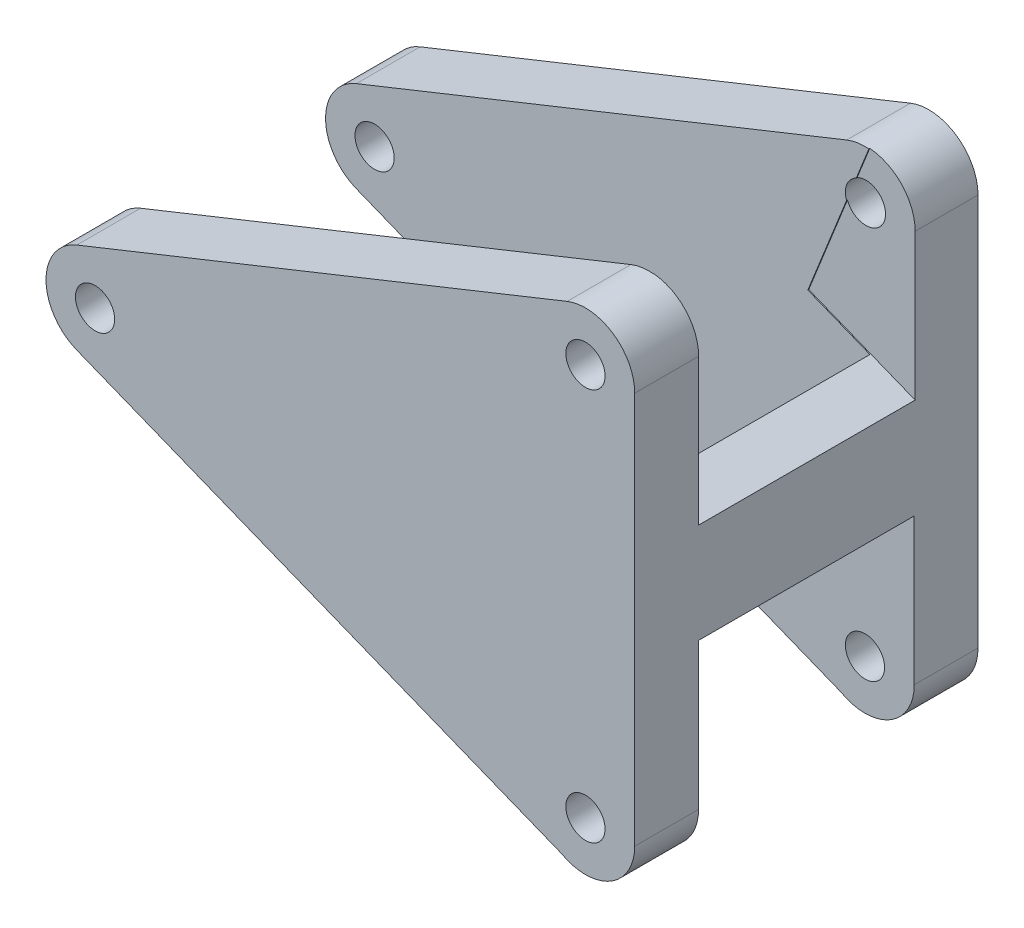
ISO-10303-21;
HEADER;
FILE_DESCRIPTION(('STEP AP214'),'2;1');
FILE_NAME('part.step','',(''),(''),'','','');
FILE_SCHEMA(('AUTOMOTIVE_DESIGN { 1 0 10303 214 1 1 1 1 }'));
ENDSEC;
DATA;
#1=APPLICATION_CONTEXT('core data for automotive mechanical design processes');
#2=APPLICATION_PROTOCOL_DEFINITION('international standard','automotive_design',2000,#1);
#3=PRODUCT_CONTEXT('',#1,'mechanical');
#4=PRODUCT('Part','Part','',(#3));
#5=PRODUCT_RELATED_PRODUCT_CATEGORY('part','',(#4));
#6=PRODUCT_DEFINITION_FORMATION('','',#4);
#7=PRODUCT_DEFINITION_CONTEXT('part definition',#1,'design');
#8=PRODUCT_DEFINITION('design','',#6,#7);
#9=PRODUCT_DEFINITION_SHAPE('','',#8);
#10=(LENGTH_UNIT() NAMED_UNIT(*) SI_UNIT(.MILLI.,.METRE.));
#11=(NAMED_UNIT(*) PLANE_ANGLE_UNIT() SI_UNIT($,.RADIAN.));
#12=(NAMED_UNIT(*) SI_UNIT($,.STERADIAN.) SOLID_ANGLE_UNIT());
#13=UNCERTAINTY_MEASURE_WITH_UNIT(LENGTH_MEASURE(1.E-05),#10,'distance_accuracy_value','');
#14=(GEOMETRIC_REPRESENTATION_CONTEXT(3) GLOBAL_UNCERTAINTY_ASSIGNED_CONTEXT((#13)) GLOBAL_UNIT_ASSIGNED_CONTEXT((#10,
#11,#12)) REPRESENTATION_CONTEXT('',''));
#15=CARTESIAN_POINT('',(0.,0.,0.));
#16=DIRECTION('',(0.,0.,1.));
#17=DIRECTION('',(1.,0.,0.));
#18=AXIS2_PLACEMENT_3D('',#15,#16,#17);
#19=CARTESIAN_POINT('',(30.5000000000063,24.9971540316062,28.4839748057166));
#20=DIRECTION('',(-1.,0.,0.));
#21=DIRECTION('',(0.,-1.,0.));
#22=AXIS2_PLACEMENT_3D('',#19,#20,#21);
#23=PLANE('',#22);
#24=DIRECTION('',(0.,0.,1.));
#25=VECTOR('',#24,1.);
#26=CARTESIAN_POINT('',(30.5000000000064,-21.9364916731021,35.));
#27=LINE('',#26,#25);
#28=CARTESIAN_POINT('',(30.5000000000064,-21.9364916731021,28.4875838937886));
#29=VERTEX_POINT('',#28);
#30=CARTESIAN_POINT('',(30.5000000000064,-21.9364916731021,28.5));
#31=VERTEX_POINT('',#30);
#32=EDGE_CURVE('E48',#29,#31,#27,.T.);
#33=ORIENTED_EDGE('',*,*,#32,.F.);
#34=DIRECTION('',(0.,1.,0.));
#35=VECTOR('',#34,1.);
#36=CARTESIAN_POINT('',(30.4999999999983,-24.9971540316023,28.4875838937886));
#37=LINE('',#36,#35);
#38=CARTESIAN_POINT('',(30.4999999999983,-24.9971540316023,28.4875838937886));
#39=VERTEX_POINT('',#38);
#40=EDGE_CURVE('E450',#39,#29,#37,.T.);
#41=ORIENTED_EDGE('',*,*,#40,.F.);
#42=DIRECTION('',(0.,0.,1.));
#43=VECTOR('',#42,1.);
#44=CARTESIAN_POINT('',(30.5000000000064,-24.9971540316024,28.4839748057166));
#45=LINE('',#44,#43);
#46=CARTESIAN_POINT('',(30.5000000000064,-24.9971540316011,28.5));
#47=VERTEX_POINT('',#46);
#48=EDGE_CURVE('E41',#39,#47,#45,.T.);
#49=ORIENTED_EDGE('',*,*,#48,.T.);
#50=DIRECTION('',(0.,-1.,0.));
#51=VECTOR('',#50,1.);
#52=CARTESIAN_POINT('',(30.5000000000063,24.9971540316062,28.5));
#53=LINE('',#52,#51);
#54=EDGE_CURVE('E229',#31,#47,#53,.T.);
#55=ORIENTED_EDGE('',*,*,#54,.F.);
#56=EDGE_LOOP('',(#33,#41,#49,#55));
#57=FACE_BOUND('',#56,.T.);
#58=ADVANCED_FACE('F33',(#57),#23,.T.);
#59=CARTESIAN_POINT('',(24.1724969948369,9.42974260186761,6.40756694681244));
#60=DIRECTION('',(-0.928632371137816,0.371001238912968,0.));
#61=DIRECTION('',(-0.371001238912968,-0.928632371137816,0.));
#62=AXIS2_PLACEMENT_3D('',#59,#60,#61);
#63=PLANE('',#62);
#64=DIRECTION('',(-0.371001238912968,-0.928632371137816,0.));
#65=VECTOR('',#64,1.);
#66=CARTESIAN_POINT('',(24.1724969948369,9.42974260186761,6.40756694681244));
#67=LINE('',#66,#65);
#68=CARTESIAN_POINT('',(28.1213591908641,19.3139178545909,6.40756694681244));
#69=VERTEX_POINT('',#68);
#70=CARTESIAN_POINT('',(24.1724969948369,9.42974260186761,6.40756694681244));
#71=VERTEX_POINT('',#70);
#72=EDGE_CURVE('E327',#69,#71,#67,.T.);
#73=ORIENTED_EDGE('',*,*,#72,.F.);
#74=DIRECTION('',(0.,0.,1.));
#75=VECTOR('',#74,1.);
#76=CARTESIAN_POINT('',(28.1213591908641,19.3139178545909,35.));
#77=LINE('',#76,#75);
#78=CARTESIAN_POINT('',(28.1213591908641,19.3139178545909,6.5));
#79=VERTEX_POINT('',#78);
#80=EDGE_CURVE('E469',#69,#79,#77,.T.);
#81=ORIENTED_EDGE('',*,*,#80,.T.);
#82=DIRECTION('',(0.371001238912964,0.928632371137818,0.));
#83=VECTOR('',#82,1.);
#84=CARTESIAN_POINT('',(24.1724969948449,9.42974260185976,6.5));
#85=LINE('',#84,#83);
#86=CARTESIAN_POINT('',(24.1724969948449,9.42974260185976,6.5));
#87=VERTEX_POINT('',#86);
#88=EDGE_CURVE('E387',#87,#79,#85,.T.);
#89=ORIENTED_EDGE('',*,*,#88,.F.);
#90=DIRECTION('',(0.,0.,1.));
#91=VECTOR('',#90,1.);
#92=CARTESIAN_POINT('',(24.1724969948369,9.42974260186761,6.40756694681244));
#93=LINE('',#92,#91);
#94=EDGE_CURVE('E334',#71,#87,#93,.T.);
#95=ORIENTED_EDGE('',*,*,#94,.F.);
#96=EDGE_LOOP('',(#73,#81,#89,#95));
#97=FACE_BOUND('',#96,.T.);
#98=ADVANCED_FACE('F468',(#97),#63,.F.);
#99=DIRECTION('',(0.,0.,1.));
#100=VECTOR('',#99,1.);
#101=CARTESIAN_POINT('',(30.5000000000064,-18.0635083268979,35.));
#102=LINE('',#101,#100);
#103=CARTESIAN_POINT('',(30.5000000000064,-18.0635083268979,28.5));
#104=VERTEX_POINT('',#103);
#105=CARTESIAN_POINT('',(30.5000000000064,-18.0635083268979,28.4875838937886));
#106=VERTEX_POINT('',#105);
#107=EDGE_CURVE('E207',#104,#106,#102,.F.);
#108=ORIENTED_EDGE('',*,*,#107,.F.);
#109=CARTESIAN_POINT('',(30.5000000000063,18.0635083268979,28.5));
#110=VERTEX_POINT('',#109);
#111=EDGE_CURVE('E219',#110,#104,#53,.T.);
#112=ORIENTED_EDGE('',*,*,#111,.F.);
#113=DIRECTION('',(0.,0.,1.));
#114=VECTOR('',#113,1.);
#115=CARTESIAN_POINT('',(30.5000000000063,18.0635083268979,35.));
#116=LINE('',#115,#114);
#117=CARTESIAN_POINT('',(30.5000000000063,18.0635083268979,28.4839748057166));
#118=VERTEX_POINT('',#117);
#119=EDGE_CURVE('E482',#118,#110,#116,.T.);
#120=ORIENTED_EDGE('',*,*,#119,.F.);
#121=DIRECTION('',(0.,1.,0.));
#122=VECTOR('',#121,1.);
#123=CARTESIAN_POINT('',(30.5000000000063,6.90181925232222,28.4839748057166));
#124=LINE('',#123,#122);
#125=CARTESIAN_POINT('',(30.4999999999937,6.90181925232222,28.4839748057166));
#126=VERTEX_POINT('',#125);
#127=EDGE_CURVE('E407',#126,#118,#124,.T.);
#128=ORIENTED_EDGE('',*,*,#127,.F.);
#129=DIRECTION('',(0.,0.,1.));
#130=VECTOR('',#129,1.);
#131=CARTESIAN_POINT('',(30.4999999999937,6.90181925232222,6.5));
#132=LINE('',#131,#130);
#133=CARTESIAN_POINT('',(30.4999999999937,6.90181925232683,6.5));
#134=VERTEX_POINT('',#133);
#135=EDGE_CURVE('E397',#134,#126,#132,.T.);
#136=ORIENTED_EDGE('',*,*,#135,.F.);
#137=DIRECTION('',(0.,1.,0.));
#138=VECTOR('',#137,1.);
#139=CARTESIAN_POINT('',(30.4999999999937,-24.9971540316023,6.5));
#140=LINE('',#139,#138);
#141=CARTESIAN_POINT('',(30.4999999999937,-6.89705549864466,6.5));
#142=VERTEX_POINT('',#141);
#143=EDGE_CURVE('E382',#142,#134,#140,.T.);
#144=ORIENTED_EDGE('',*,*,#143,.F.);
#145=DIRECTION('',(0.,0.,-1.));
#146=VECTOR('',#145,1.);
#147=CARTESIAN_POINT('',(30.4999999999983,-6.89705549864466,28.4875838937886));
#148=LINE('',#147,#146);
#149=CARTESIAN_POINT('',(30.4999999999983,-6.89705549864466,28.4875838937886));
#150=VERTEX_POINT('',#149);
#151=EDGE_CURVE('E377',#150,#142,#148,.T.);
#152=ORIENTED_EDGE('',*,*,#151,.F.);
#153=EDGE_CURVE('E221',#106,#150,#37,.T.);
#154=ORIENTED_EDGE('',*,*,#153,.F.);
#155=EDGE_LOOP('',(#108,#112,#120,#128,#136,#144,#152,#154));
#156=FACE_BOUND('',#155,.T.);
#157=ADVANCED_FACE('F217',(#156),#23,.T.);
#158=CARTESIAN_POINT('',(30.,-20.,35.));
#159=DIRECTION('',(0.,0.,-1.));
#160=DIRECTION('',(-1.,0.,0.));
#161=AXIS2_PLACEMENT_3D('',#158,#159,#160);
#162=PLANE('',#161);
#163=CARTESIAN_POINT('',(30.,-20.,35.));
#164=DIRECTION('',(0.,0.,1.));
#165=DIRECTION('',(1.,0.,0.));
#166=AXIS2_PLACEMENT_3D('',#163,#164,#165);
#167=CIRCLE('',#166,1.99999999999999);
#168=CARTESIAN_POINT('',(32.,-20.,35.));
#169=VERTEX_POINT('',#168);
#170=EDGE_CURVE('E212',#169,#169,#167,.T.);
#171=ORIENTED_EDGE('',*,*,#170,.F.);
#172=EDGE_LOOP('',(#171));
#173=FACE_BOUND('',#172,.T.);
#174=CARTESIAN_POINT('',(-20.,0.,35.));
#175=DIRECTION('',(0.,0.,1.));
#176=DIRECTION('',(1.,0.,0.));
#177=AXIS2_PLACEMENT_3D('',#174,#175,#176);
#178=CIRCLE('',#177,1.99999999999998);
#179=CARTESIAN_POINT('',(-18.,0.,35.));
#180=VERTEX_POINT('',#179);
#181=EDGE_CURVE('E500',#180,#180,#178,.T.);
#182=ORIENTED_EDGE('',*,*,#181,.F.);
#183=EDGE_LOOP('',(#182));
#184=FACE_BOUND('',#183,.T.);
#185=CARTESIAN_POINT('',(30.,-20.,35.));
#186=DIRECTION('',(0.,0.,1.));
#187=DIRECTION('',(-1.,0.,0.));
#188=AXIS2_PLACEMENT_3D('',#185,#186,#187);
#189=CIRCLE('',#188,5.02210597414605);
#190=CARTESIAN_POINT('',(27.5325788494892,-24.3741720681251,35.));
#191=VERTEX_POINT('',#190);
#192=CARTESIAN_POINT('',(35.0221059741461,-20.,35.));
#193=VERTEX_POINT('',#192);
#194=EDGE_CURVE('E257',#191,#193,#189,.T.);
#195=ORIENTED_EDGE('',*,*,#194,.T.);
#196=DIRECTION('',(0.,1.,0.));
#197=VECTOR('',#196,1.);
#198=CARTESIAN_POINT('',(35.0221059741461,19.9999999999929,35.));
#199=LINE('',#198,#197);
#200=CARTESIAN_POINT('',(35.0221059741461,19.9999999999929,35.));
#201=VERTEX_POINT('',#200);
#202=EDGE_CURVE('E262',#193,#201,#199,.T.);
#203=ORIENTED_EDGE('',*,*,#202,.T.);
#204=CARTESIAN_POINT('',(29.9999999999952,19.9999999999929,35.));
#205=DIRECTION('',(0.,0.,1.));
#206=DIRECTION('',(-1.,0.,0.));
#207=AXIS2_PLACEMENT_3D('',#204,#205,#206);
#208=CIRCLE('',#207,5.02210597415085);
#209=CARTESIAN_POINT('',(28.1329227098393,24.6621422981415,35.));
#210=VERTEX_POINT('',#209);
#211=EDGE_CURVE('E268',#201,#210,#208,.T.);
#212=ORIENTED_EDGE('',*,*,#211,.T.);
#213=DIRECTION('',(-0.928324157663127,-0.371771782548172,0.));
#214=VECTOR('',#213,1.);
#215=CARTESIAN_POINT('',(-21.8588589127408,4.64162078831564,35.));
#216=LINE('',#215,#214);
#217=CARTESIAN_POINT('',(-21.8588589127408,4.64162078831564,35.));
#218=VERTEX_POINT('',#217);
#219=EDGE_CURVE('E284',#210,#218,#216,.T.);
#220=ORIENTED_EDGE('',*,*,#219,.T.);
#221=CARTESIAN_POINT('',(-20.,0.,35.));
#222=DIRECTION('',(0.,0.,1.));
#223=DIRECTION('',(-1.,0.,0.));
#224=AXIS2_PLACEMENT_3D('',#221,#222,#223);
#225=CIRCLE('',#224,5.);
#226=CARTESIAN_POINT('',(-21.8569533817705,-4.6423834544263,35.));
#227=VERTEX_POINT('',#226);
#228=EDGE_CURVE('E286',#218,#227,#225,.T.);
#229=ORIENTED_EDGE('',*,*,#228,.T.);
#230=DIRECTION('',(0.928632371137817,-0.371001238912967,0.));
#231=VECTOR('',#230,1.);
#232=CARTESIAN_POINT('',(27.5325788494892,-24.3741720681251,35.));
#233=LINE('',#232,#231);
#234=EDGE_CURVE('E273',#227,#191,#233,.T.);
#235=ORIENTED_EDGE('',*,*,#234,.T.);
#236=EDGE_LOOP('',(#195,#203,#212,#220,#229,#235));
#237=FACE_BOUND('',#236,.T.);
#238=CARTESIAN_POINT('',(30.,20.,35.));
#239=DIRECTION('',(0.,0.,1.));
#240=DIRECTION('',(1.,0.,0.));
#241=AXIS2_PLACEMENT_3D('',#238,#239,#240);
#242=CIRCLE('',#241,1.99999999999999);
#243=CARTESIAN_POINT('',(32.,20.,35.));
#244=VERTEX_POINT('',#243);
#245=EDGE_CURVE('E476',#244,#244,#242,.T.);
#246=ORIENTED_EDGE('',*,*,#245,.F.);
#247=EDGE_LOOP('',(#246));
#248=FACE_BOUND('',#247,.T.);
#249=ADVANCED_FACE('F270',(#173,#184,#237,#248),#162,.F.);
#250=CARTESIAN_POINT('',(-20.0000000000093,3.72987231378463E-12,0.));
#251=DIRECTION('',(0.,0.,1.));
#252=DIRECTION('',(1.,0.,0.));
#253=AXIS2_PLACEMENT_3D('',#250,#251,#252);
#254=PLANE('',#253);
#255=CARTESIAN_POINT('',(30.,-20.,0.));
#256=DIRECTION('',(0.,0.,1.));
#257=DIRECTION('',(1.,0.,0.));
#258=AXIS2_PLACEMENT_3D('',#255,#256,#257);
#259=CIRCLE('',#258,1.99999999999999);
#260=CARTESIAN_POINT('',(32.,-20.,0.));
#261=VERTEX_POINT('',#260);
#262=EDGE_CURVE('E497',#261,#261,#259,.T.);
#263=ORIENTED_EDGE('',*,*,#262,.T.);
#264=EDGE_LOOP('',(#263));
#265=FACE_BOUND('',#264,.T.);
#266=CARTESIAN_POINT('',(-20.0000000000093,3.72987231378463E-12,0.));
#267=DIRECTION('',(0.,0.,-1.));
#268=DIRECTION('',(1.,0.,0.));
#269=AXIS2_PLACEMENT_3D('',#266,#267,#268);
#270=CIRCLE('',#269,5.);
#271=CARTESIAN_POINT('',(-21.8569533817705,-4.6423834544263,0.));
#272=VERTEX_POINT('',#271);
#273=CARTESIAN_POINT('',(-21.8588589127502,4.64162078831937,0.));
#274=VERTEX_POINT('',#273);
#275=EDGE_CURVE('E309',#272,#274,#270,.T.);
#276=ORIENTED_EDGE('',*,*,#275,.T.);
#277=DIRECTION('',(0.928324157663127,0.371771782548172,0.));
#278=VECTOR('',#277,1.);
#279=CARTESIAN_POINT('',(28.132922709839,24.6621422981488,0.));
#280=LINE('',#279,#278);
#281=CARTESIAN_POINT('',(28.132922709839,24.6621422981488,0.));
#282=VERTEX_POINT('',#281);
#283=EDGE_CURVE('E312',#274,#282,#280,.T.);
#284=ORIENTED_EDGE('',*,*,#283,.T.);
#285=CARTESIAN_POINT('',(29.9999999999949,20.,0.));
#286=DIRECTION('',(0.,0.,-1.));
#287=DIRECTION('',(1.,0.,0.));
#288=AXIS2_PLACEMENT_3D('',#285,#286,#287);
#289=CIRCLE('',#288,5.02210597415111);
#290=CARTESIAN_POINT('',(35.0221059741461,20.,0.));
#291=VERTEX_POINT('',#290);
#292=EDGE_CURVE('E315',#282,#291,#289,.T.);
#293=ORIENTED_EDGE('',*,*,#292,.T.);
#294=DIRECTION('',(0.,-1.,0.));
#295=VECTOR('',#294,1.);
#296=CARTESIAN_POINT('',(35.0221059741461,-20.,0.));
#297=LINE('',#296,#295);
#298=CARTESIAN_POINT('',(35.0221059741461,-20.,0.));
#299=VERTEX_POINT('',#298);
#300=EDGE_CURVE('E318',#291,#299,#297,.T.);
#301=ORIENTED_EDGE('',*,*,#300,.T.);
#302=CARTESIAN_POINT('',(30.,-20.,0.));
#303=DIRECTION('',(0.,0.,-1.));
#304=DIRECTION('',(1.,0.,0.));
#305=AXIS2_PLACEMENT_3D('',#302,#303,#304);
#306=CIRCLE('',#305,5.02210597414605);
#307=CARTESIAN_POINT('',(27.5325788494892,-24.3741720681251,0.));
#308=VERTEX_POINT('',#307);
#309=EDGE_CURVE('E321',#299,#308,#306,.T.);
#310=ORIENTED_EDGE('',*,*,#309,.T.);
#311=DIRECTION('',(-0.928632371137817,0.371001238912967,0.));
#312=VECTOR('',#311,1.);
#313=CARTESIAN_POINT('',(-21.8569533817705,-4.6423834544263,0.));
#314=LINE('',#313,#312);
#315=EDGE_CURVE('E324',#308,#272,#314,.T.);
#316=ORIENTED_EDGE('',*,*,#315,.T.);
#317=EDGE_LOOP('',(#276,#284,#293,#301,#310,#316));
#318=FACE_BOUND('',#317,.T.);
#319=CARTESIAN_POINT('',(-20.,0.,0.));
#320=DIRECTION('',(0.,0.,-1.));
#321=DIRECTION('',(-1.,0.,0.));
#322=AXIS2_PLACEMENT_3D('',#319,#320,#321);
#323=CIRCLE('',#322,1.99999999999996);
#324=CARTESIAN_POINT('',(-22.,0.,0.));
#325=VERTEX_POINT('',#324);
#326=EDGE_CURVE('E488',#325,#325,#323,.T.);
#327=ORIENTED_EDGE('',*,*,#326,.F.);
#328=EDGE_LOOP('',(#327));
#329=FACE_BOUND('',#328,.T.);
#330=CARTESIAN_POINT('',(30.,20.,0.));
#331=DIRECTION('',(0.,0.,-1.));
#332=DIRECTION('',(-1.,0.,0.));
#333=AXIS2_PLACEMENT_3D('',#330,#331,#332);
#334=CIRCLE('',#333,1.99999999999997);
#335=CARTESIAN_POINT('',(28.,20.,0.));
#336=VERTEX_POINT('',#335);
#337=EDGE_CURVE('E485',#336,#336,#334,.T.);
#338=ORIENTED_EDGE('',*,*,#337,.F.);
#339=EDGE_LOOP('',(#338));
#340=FACE_BOUND('',#339,.T.);
#341=ADVANCED_FACE('F358',(#265,#318,#329,#340),#254,.F.);
#342=CARTESIAN_POINT('',(35.0221059741587,-20.,28.4839748057166));
#343=DIRECTION('',(1.,0.,0.));
#344=DIRECTION('',(0.,0.,-1.));
#345=AXIS2_PLACEMENT_3D('',#342,#343,#344);
#346=PLANE('',#345);
#347=DIRECTION('',(0.,0.,1.));
#348=VECTOR('',#347,1.);
#349=CARTESIAN_POINT('',(35.0221059741587,-20.,28.4839748057166));
#350=LINE('',#349,#348);
#351=CARTESIAN_POINT('',(35.0221059741498,-20.0000000000001,28.4875838937886));
#352=VERTEX_POINT('',#351);
#353=EDGE_CURVE('E231',#352,#193,#350,.T.);
#354=ORIENTED_EDGE('',*,*,#353,.F.);
#355=DIRECTION('',(0.,-1.,0.));
#356=VECTOR('',#355,1.);
#357=CARTESIAN_POINT('',(35.0221059741498,-5.08605943115665,28.4875838937886));
#358=LINE('',#357,#356);
#359=CARTESIAN_POINT('',(35.0221059741498,-5.08605943115665,28.4875838937886));
#360=VERTEX_POINT('',#359);
#361=EDGE_CURVE('E380',#360,#352,#358,.T.);
#362=ORIENTED_EDGE('',*,*,#361,.F.);
#363=DIRECTION('',(0.,0.,-1.));
#364=VECTOR('',#363,1.);
#365=CARTESIAN_POINT('',(35.0221059741498,-5.08605943115665,28.4875838937886));
#366=LINE('',#365,#364);
#367=CARTESIAN_POINT('',(35.0221059741498,-5.08605943115665,6.5));
#368=VERTEX_POINT('',#367);
#369=EDGE_CURVE('E367',#360,#368,#366,.T.);
#370=ORIENTED_EDGE('',*,*,#369,.T.);
#371=DIRECTION('',(0.,-1.,0.));
#372=VECTOR('',#371,1.);
#373=CARTESIAN_POINT('',(35.0221059741498,-5.08605943115665,6.5));
#374=LINE('',#373,#372);
#375=CARTESIAN_POINT('',(35.0221059741498,-20.0000000000001,6.5));
#376=VERTEX_POINT('',#375);
#377=EDGE_CURVE('E366',#368,#376,#374,.T.);
#378=ORIENTED_EDGE('',*,*,#377,.T.);
#379=EDGE_CURVE('E243',#299,#376,#350,.T.);
#380=ORIENTED_EDGE('',*,*,#379,.F.);
#381=ORIENTED_EDGE('',*,*,#300,.F.);
#382=DIRECTION('',(0.,0.,1.));
#383=VECTOR('',#382,1.);
#384=CARTESIAN_POINT('',(35.0221059741587,19.999999999997,28.4839748057166));
#385=LINE('',#384,#383);
#386=CARTESIAN_POINT('',(35.0221059741524,19.9999999999999,6.40756694681244));
#387=VERTEX_POINT('',#386);
#388=EDGE_CURVE('E240',#291,#387,#385,.T.);
#389=ORIENTED_EDGE('',*,*,#388,.T.);
#390=DIRECTION('',(0.,-1.,0.));
#391=VECTOR('',#390,1.);
#392=CARTESIAN_POINT('',(35.0221059741524,19.9999999999999,6.40756694681244));
#393=LINE('',#392,#391);
#394=CARTESIAN_POINT('',(35.0221059741524,5.09517652582724,6.40756694681244));
#395=VERTEX_POINT('',#394);
#396=EDGE_CURVE('E399',#387,#395,#393,.T.);
#397=ORIENTED_EDGE('',*,*,#396,.T.);
#398=DIRECTION('',(0.,0.,-1.));
#399=VECTOR('',#398,1.);
#400=CARTESIAN_POINT('',(35.0221059741524,5.09517652582724,28.4839748057166));
#401=LINE('',#400,#399);
#402=CARTESIAN_POINT('',(35.0221059741524,5.09517652582724,28.4839748057166));
#403=VERTEX_POINT('',#402);
#404=EDGE_CURVE('E280',#403,#395,#401,.T.);
#405=ORIENTED_EDGE('',*,*,#404,.F.);
#406=DIRECTION('',(0.,-1.,0.));
#407=VECTOR('',#406,1.);
#408=CARTESIAN_POINT('',(35.0221059741524,19.9999999999999,28.4839748057166));
#409=LINE('',#408,#407);
#410=CARTESIAN_POINT('',(35.0221059741524,19.9999999999999,28.4839748057166));
#411=VERTEX_POINT('',#410);
#412=EDGE_CURVE('E400',#411,#403,#409,.T.);
#413=ORIENTED_EDGE('',*,*,#412,.F.);
#414=EDGE_CURVE('E242',#411,#201,#385,.T.);
#415=ORIENTED_EDGE('',*,*,#414,.T.);
#416=ORIENTED_EDGE('',*,*,#202,.F.);
#417=EDGE_LOOP('',(#354,#362,#370,#378,#380,#381,#389,#397,#405,#413,#415,#416));
#418=FACE_BOUND('',#417,.T.);
#419=ADVANCED_FACE('F263',(#418),#346,.T.);
#420=CARTESIAN_POINT('',(30.0000000000126,-20.,28.4839748057166));
#421=DIRECTION('',(0.,0.,1.));
#422=DIRECTION('',(1.,0.,0.));
#423=AXIS2_PLACEMENT_3D('',#420,#421,#422);
#424=CYLINDRICAL_SURFACE('',#423,5.02210597414605);
#425=ORIENTED_EDGE('',*,*,#48,.F.);
#426=CARTESIAN_POINT('',(30.0000000000038,-20.0000000000001,28.4875838937886));
#427=DIRECTION('',(0.,0.,-1.));
#428=DIRECTION('',(-1.,0.,0.));
#429=AXIS2_PLACEMENT_3D('',#426,#427,#428);
#430=CIRCLE('',#429,5.02210597414604);
#431=EDGE_CURVE('E258',#352,#39,#430,.T.);
#432=ORIENTED_EDGE('',*,*,#431,.F.);
#433=ORIENTED_EDGE('',*,*,#353,.T.);
#434=ORIENTED_EDGE('',*,*,#194,.F.);
#435=DIRECTION('',(0.,0.,-1.));
#436=VECTOR('',#435,1.);
#437=CARTESIAN_POINT('',(27.5325788494892,-24.3741720681251,35.));
#438=LINE('',#437,#436);
#439=CARTESIAN_POINT('',(27.5325788494892,-24.3741720681251,28.5));
#440=VERTEX_POINT('',#439);
#441=EDGE_CURVE('E289',#191,#440,#438,.T.);
#442=ORIENTED_EDGE('',*,*,#441,.T.);
#443=CARTESIAN_POINT('',(30.,-20.,28.5));
#444=DIRECTION('',(0.,0.,1.));
#445=DIRECTION('',(-1.,0.,0.));
#446=AXIS2_PLACEMENT_3D('',#443,#444,#445);
#447=CIRCLE('',#446,5.02210597414605);
#448=EDGE_CURVE('E290',#440,#47,#447,.T.);
#449=ORIENTED_EDGE('',*,*,#448,.T.);
#450=EDGE_LOOP('',(#425,#432,#433,#434,#442,#449));
#451=FACE_BOUND('',#450,.T.);
#452=ADVANCED_FACE('F254',(#451),#424,.T.);
#453=CARTESIAN_POINT('',(30.0000000000051,19.999999999997,28.4839748057166));
#454=DIRECTION('',(0.,0.,1.));
#455=DIRECTION('',(1.,0.,0.));
#456=AXIS2_PLACEMENT_3D('',#453,#454,#455);
#457=CYLINDRICAL_SURFACE('',#456,5.02210597415363);
#458=DIRECTION('',(0.,0.,1.));
#459=VECTOR('',#458,1.);
#460=CARTESIAN_POINT('',(28.1329227098355,24.6621422981511,6.40756694681244));
#461=LINE('',#460,#459);
#462=CARTESIAN_POINT('',(28.1329227098459,24.6621422981441,6.5));
#463=VERTEX_POINT('',#462);
#464=EDGE_CURVE('E340',#282,#463,#461,.T.);
#465=ORIENTED_EDGE('',*,*,#464,.T.);
#466=CARTESIAN_POINT('',(30.0000000000009,19.9999999999977,6.5));
#467=DIRECTION('',(0.,0.,1.));
#468=DIRECTION('',(1.,0.,0.));
#469=AXIS2_PLACEMENT_3D('',#466,#467,#468);
#470=CIRCLE('',#469,5.02210597414859);
#471=CARTESIAN_POINT('',(30.3956225957856,25.0064988941635,6.5));
#472=VERTEX_POINT('',#471);
#473=EDGE_CURVE('E390',#472,#463,#470,.T.);
#474=ORIENTED_EDGE('',*,*,#473,.F.);
#475=DIRECTION('',(0.,0.,1.));
#476=VECTOR('',#475,1.);
#477=CARTESIAN_POINT('',(30.3956225957775,25.0064988941708,6.40756694681244));
#478=LINE('',#477,#476);
#479=CARTESIAN_POINT('',(30.3956225957775,25.0064988941708,6.40756694681244));
#480=VERTEX_POINT('',#479);
#481=EDGE_CURVE('E337',#480,#472,#478,.T.);
#482=ORIENTED_EDGE('',*,*,#481,.F.);
#483=CARTESIAN_POINT('',(29.9999999999949,20.,6.40756694681244));
#484=DIRECTION('',(0.,0.,-1.));
#485=DIRECTION('',(1.,0.,0.));
#486=AXIS2_PLACEMENT_3D('',#483,#484,#485);
#487=CIRCLE('',#486,5.02210597415111);
#488=EDGE_CURVE('E308',#480,#387,#487,.T.);
#489=ORIENTED_EDGE('',*,*,#488,.T.);
#490=ORIENTED_EDGE('',*,*,#388,.F.);
#491=ORIENTED_EDGE('',*,*,#292,.F.);
#492=EDGE_LOOP('',(#465,#474,#482,#489,#490,#491));
#493=FACE_BOUND('',#492,.T.);
#494=ADVANCED_FACE('F532',(#493),#457,.T.);
#495=CARTESIAN_POINT('',(-21.8569533817705,-4.6423834544263,6.40756694681244));
#496=DIRECTION('',(0.371001238912967,0.928632371137817,0.));
#497=DIRECTION('',(-0.928632371137817,0.371001238912967,0.));
#498=AXIS2_PLACEMENT_3D('',#495,#496,#497);
#499=PLANE('',#498);
#500=DIRECTION('',(0.928632371137817,-0.371001238912967,0.));
#501=VECTOR('',#500,1.);
#502=CARTESIAN_POINT('',(-21.8569533817705,-4.6423834544263,6.5));
#503=LINE('',#502,#501);
#504=CARTESIAN_POINT('',(-21.8569533817705,-4.6423834544263,6.5));
#505=VERTEX_POINT('',#504);
#506=CARTESIAN_POINT('',(27.5325788494892,-24.374172068125,6.5));
#507=VERTEX_POINT('',#506);
#508=EDGE_CURVE('E355',#505,#507,#503,.T.);
#509=ORIENTED_EDGE('',*,*,#508,.F.);
#510=DIRECTION('',(0.,0.,1.));
#511=VECTOR('',#510,1.);
#512=CARTESIAN_POINT('',(-21.8569533817705,-4.6423834544263,6.40756694681244));
#513=LINE('',#512,#511);
#514=EDGE_CURVE('E345',#272,#505,#513,.T.);
#515=ORIENTED_EDGE('',*,*,#514,.F.);
#516=ORIENTED_EDGE('',*,*,#315,.F.);
#517=DIRECTION('',(0.,0.,1.));
#518=VECTOR('',#517,1.);
#519=CARTESIAN_POINT('',(27.5325788494892,-24.3741720681251,6.40756694681244));
#520=LINE('',#519,#518);
#521=EDGE_CURVE('E232',#308,#507,#520,.T.);
#522=ORIENTED_EDGE('',*,*,#521,.T.);
#523=EDGE_LOOP('',(#509,#515,#516,#522));
#524=FACE_BOUND('',#523,.T.);
#525=ADVANCED_FACE('F354',(#524),#499,.F.);
#526=CARTESIAN_POINT('',(-20.000000000014,5.59556741219769E-12,6.40756694681244));
#527=DIRECTION('',(0.,0.,1.));
#528=DIRECTION('',(1.,0.,0.));
#529=AXIS2_PLACEMENT_3D('',#526,#527,#528);
#530=CYLINDRICAL_SURFACE('',#529,5.);
#531=CARTESIAN_POINT('',(-20.,0.,6.5));
#532=DIRECTION('',(0.,0.,1.));
#533=DIRECTION('',(1.,0.,0.));
#534=AXIS2_PLACEMENT_3D('',#531,#532,#533);
#535=CIRCLE('',#534,5.);
#536=CARTESIAN_POINT('',(-21.8588589127408,4.64162078831564,6.5));
#537=VERTEX_POINT('',#536);
#538=EDGE_CURVE('E394',#537,#505,#535,.T.);
#539=ORIENTED_EDGE('',*,*,#538,.F.);
#540=DIRECTION('',(0.,0.,1.));
#541=VECTOR('',#540,1.);
#542=CARTESIAN_POINT('',(-21.8588589127548,4.64162078832123,6.40756694681244));
#543=LINE('',#542,#541);
#544=EDGE_CURVE('E343',#274,#537,#543,.T.);
#545=ORIENTED_EDGE('',*,*,#544,.F.);
#546=ORIENTED_EDGE('',*,*,#275,.F.);
#547=ORIENTED_EDGE('',*,*,#514,.T.);
#548=EDGE_LOOP('',(#539,#545,#546,#547));
#549=FACE_BOUND('',#548,.T.);
#550=ADVANCED_FACE('F637',(#549),#530,.T.);
#551=CARTESIAN_POINT('',(28.1329227098355,24.6621422981511,6.40756694681244));
#552=DIRECTION('',(0.371771782548172,-0.928324157663127,0.));
#553=DIRECTION('',(0.928324157663127,0.371771782548172,0.));
#554=AXIS2_PLACEMENT_3D('',#551,#552,#553);
#555=PLANE('',#554);
#556=DIRECTION('',(-0.928324157663127,-0.371771782548172,0.));
#557=VECTOR('',#556,1.);
#558=CARTESIAN_POINT('',(28.1329227098459,24.6621422981441,6.5));
#559=LINE('',#558,#557);
#560=EDGE_CURVE('E392',#463,#537,#559,.T.);
#561=ORIENTED_EDGE('',*,*,#560,.F.);
#562=ORIENTED_EDGE('',*,*,#464,.F.);
#563=ORIENTED_EDGE('',*,*,#283,.F.);
#564=ORIENTED_EDGE('',*,*,#544,.T.);
#565=EDGE_LOOP('',(#561,#562,#563,#564));
#566=FACE_BOUND('',#565,.T.);
#567=ADVANCED_FACE('F533',(#566),#555,.F.);
#568=CARTESIAN_POINT('',(29.1112618451264,21.7916876100682,6.5));
#569=VERTEX_POINT('',#568);
#570=EDGE_CURVE('E386',#569,#472,#85,.T.);
#571=ORIENTED_EDGE('',*,*,#570,.F.);
#572=DIRECTION('',(0.,0.,1.));
#573=VECTOR('',#572,1.);
#574=CARTESIAN_POINT('',(29.1112618451264,21.7916876100682,35.));
#575=LINE('',#574,#573);
#576=CARTESIAN_POINT('',(29.1112618451263,21.7916876100681,6.40756694681244));
#577=VERTEX_POINT('',#576);
#578=EDGE_CURVE('E472',#569,#577,#575,.F.);
#579=ORIENTED_EDGE('',*,*,#578,.T.);
#580=EDGE_CURVE('E329',#480,#577,#67,.T.);
#581=ORIENTED_EDGE('',*,*,#580,.F.);
#582=ORIENTED_EDGE('',*,*,#481,.T.);
#583=EDGE_LOOP('',(#571,#579,#581,#582));
#584=FACE_BOUND('',#583,.T.);
#585=ADVANCED_FACE('F522',(#584),#63,.F.);
#586=DIRECTION('',(0.,0.,1.));
#587=VECTOR('',#586,1.);
#588=CARTESIAN_POINT('',(30.5000000000063,21.9364916731021,35.));
#589=LINE('',#588,#587);
#590=CARTESIAN_POINT('',(30.5000000000063,21.9364916731021,28.5));
#591=VERTEX_POINT('',#590);
#592=CARTESIAN_POINT('',(30.5000000000063,21.9364916731021,28.4839748057166));
#593=VERTEX_POINT('',#592);
#594=EDGE_CURVE('E56',#591,#593,#589,.F.);
#595=ORIENTED_EDGE('',*,*,#594,.F.);
#596=CARTESIAN_POINT('',(30.5000000000063,24.9971540316062,28.5));
#597=VERTEX_POINT('',#596);
#598=EDGE_CURVE('E228',#597,#591,#53,.T.);
#599=ORIENTED_EDGE('',*,*,#598,.F.);
#600=DIRECTION('',(0.,0.,1.));
#601=VECTOR('',#600,1.);
#602=CARTESIAN_POINT('',(30.5000000000063,24.9971540316062,28.4839748057166));
#603=LINE('',#602,#601);
#604=CARTESIAN_POINT('',(30.5000000000063,24.9971540316062,28.4839748057166));
#605=VERTEX_POINT('',#604);
#606=EDGE_CURVE('E238',#605,#597,#603,.T.);
#607=ORIENTED_EDGE('',*,*,#606,.F.);
#608=EDGE_CURVE('E406',#593,#605,#124,.T.);
#609=ORIENTED_EDGE('',*,*,#608,.F.);
#610=EDGE_LOOP('',(#595,#599,#607,#609));
#611=FACE_BOUND('',#610,.T.);
#612=ADVANCED_FACE('F517',(#611),#23,.T.);
#613=ORIENTED_EDGE('',*,*,#414,.F.);
#614=CARTESIAN_POINT('',(30.0000000000013,19.9999999999999,28.4839748057166));
#615=DIRECTION('',(0.,0.,-1.));
#616=DIRECTION('',(-1.,0.,0.));
#617=AXIS2_PLACEMENT_3D('',#614,#615,#616);
#618=CIRCLE('',#617,5.02210597415111);
#619=EDGE_CURVE('E410',#605,#411,#618,.T.);
#620=ORIENTED_EDGE('',*,*,#619,.F.);
#621=ORIENTED_EDGE('',*,*,#606,.T.);
#622=CARTESIAN_POINT('',(29.9999999999952,19.9999999999929,28.5));
#623=DIRECTION('',(0.,0.,1.));
#624=DIRECTION('',(-1.,0.,0.));
#625=AXIS2_PLACEMENT_3D('',#622,#623,#624);
#626=CIRCLE('',#625,5.02210597415085);
#627=CARTESIAN_POINT('',(28.1329227098393,24.6621422981415,28.5));
#628=VERTEX_POINT('',#627);
#629=EDGE_CURVE('E293',#597,#628,#626,.T.);
#630=ORIENTED_EDGE('',*,*,#629,.T.);
#631=DIRECTION('',(0.,0.,-1.));
#632=VECTOR('',#631,1.);
#633=CARTESIAN_POINT('',(28.1329227098393,24.6621422981415,35.));
#634=LINE('',#633,#632);
#635=EDGE_CURVE('E305',#210,#628,#634,.T.);
#636=ORIENTED_EDGE('',*,*,#635,.F.);
#637=ORIENTED_EDGE('',*,*,#211,.F.);
#638=EDGE_LOOP('',(#613,#620,#621,#630,#636,#637));
#639=FACE_BOUND('',#638,.T.);
#640=ADVANCED_FACE('F430',(#639),#457,.T.);
#641=ORIENTED_EDGE('',*,*,#379,.T.);
#642=CARTESIAN_POINT('',(30.,-20.,6.5));
#643=DIRECTION('',(0.,0.,1.));
#644=DIRECTION('',(1.,0.,0.));
#645=AXIS2_PLACEMENT_3D('',#642,#643,#644);
#646=CIRCLE('',#645,5.02210597414604);
#647=EDGE_CURVE('E356',#507,#376,#646,.T.);
#648=ORIENTED_EDGE('',*,*,#647,.F.);
#649=ORIENTED_EDGE('',*,*,#521,.F.);
#650=ORIENTED_EDGE('',*,*,#309,.F.);
#651=EDGE_LOOP('',(#641,#648,#649,#650));
#652=FACE_BOUND('',#651,.T.);
#653=ADVANCED_FACE('F35',(#652),#424,.T.);
#654=CARTESIAN_POINT('',(30.499999999999,6.90181925232472,6.40756694681244));
#655=DIRECTION('',(-0.371001238912968,-0.928632371137816,0.));
#656=DIRECTION('',(0.928632371137816,-0.371001238912968,0.));
#657=AXIS2_PLACEMENT_3D('',#654,#655,#656);
#658=PLANE('',#657);
#659=DIRECTION('',(-0.928632371137818,0.371001238912964,0.));
#660=VECTOR('',#659,1.);
#661=CARTESIAN_POINT('',(30.4999999999937,6.90181925232222,6.5));
#662=LINE('',#661,#660);
#663=EDGE_CURVE('E384',#134,#87,#662,.T.);
#664=ORIENTED_EDGE('',*,*,#663,.F.);
#665=ORIENTED_EDGE('',*,*,#135,.T.);
#666=DIRECTION('',(-0.928632371137816,0.371001238912969,0.));
#667=VECTOR('',#666,1.);
#668=CARTESIAN_POINT('',(35.0221059741524,5.09517652582724,28.4839748057166));
#669=LINE('',#668,#667);
#670=EDGE_CURVE('E403',#403,#126,#669,.T.);
#671=ORIENTED_EDGE('',*,*,#670,.F.);
#672=ORIENTED_EDGE('',*,*,#404,.T.);
#673=DIRECTION('',(0.928632371137816,-0.371001238912968,0.));
#674=VECTOR('',#673,1.);
#675=CARTESIAN_POINT('',(30.499999999999,6.90181925232472,6.40756694681244));
#676=LINE('',#675,#674);
#677=EDGE_CURVE('E332',#71,#395,#676,.T.);
#678=ORIENTED_EDGE('',*,*,#677,.F.);
#679=ORIENTED_EDGE('',*,*,#94,.T.);
#680=EDGE_LOOP('',(#664,#665,#671,#672,#678,#679));
#681=FACE_BOUND('',#680,.T.);
#682=ADVANCED_FACE('F423',(#681),#658,.F.);
#683=CARTESIAN_POINT('',(-20.0000000000093,3.72987231378463E-12,6.40756694681244));
#684=DIRECTION('',(0.,0.,1.));
#685=DIRECTION('',(1.,0.,0.));
#686=AXIS2_PLACEMENT_3D('',#683,#684,#685);
#687=PLANE('',#686);
#688=CARTESIAN_POINT('',(30.,20.,6.40756694681244));
#689=DIRECTION('',(0.,0.,1.));
#690=DIRECTION('',(1.,0.,0.));
#691=AXIS2_PLACEMENT_3D('',#688,#689,#690);
#692=CIRCLE('',#691,1.99999999999997);
#693=EDGE_CURVE('E11',#69,#577,#692,.T.);
#694=ORIENTED_EDGE('',*,*,#693,.F.);
#695=ORIENTED_EDGE('',*,*,#72,.T.);
#696=ORIENTED_EDGE('',*,*,#677,.T.);
#697=ORIENTED_EDGE('',*,*,#396,.F.);
#698=ORIENTED_EDGE('',*,*,#488,.F.);
#699=ORIENTED_EDGE('',*,*,#580,.T.);
#700=EDGE_LOOP('',(#694,#695,#696,#697,#698,#699));
#701=FACE_BOUND('',#700,.T.);
#702=ADVANCED_FACE('F417',(#701),#687,.T.);
#703=CARTESIAN_POINT('',(-21.8588589127408,4.64162078831564,35.));
#704=DIRECTION('',(0.371771782548172,-0.928324157663127,0.));
#705=DIRECTION('',(0.928324157663127,0.371771782548172,0.));
#706=AXIS2_PLACEMENT_3D('',#703,#704,#705);
#707=PLANE('',#706);
#708=DIRECTION('',(-0.928324157663127,-0.371771782548172,0.));
#709=VECTOR('',#708,1.);
#710=CARTESIAN_POINT('',(-21.8588589127408,4.64162078831564,28.5));
#711=LINE('',#710,#709);
#712=CARTESIAN_POINT('',(-21.8588589127408,4.64162078831564,28.5));
#713=VERTEX_POINT('',#712);
#714=EDGE_CURVE('E295',#628,#713,#711,.T.);
#715=ORIENTED_EDGE('',*,*,#714,.T.);
#716=DIRECTION('',(0.,0.,-1.));
#717=VECTOR('',#716,1.);
#718=CARTESIAN_POINT('',(-21.8588589127408,4.64162078831564,35.));
#719=LINE('',#718,#717);
#720=EDGE_CURVE('E302',#218,#713,#719,.T.);
#721=ORIENTED_EDGE('',*,*,#720,.F.);
#722=ORIENTED_EDGE('',*,*,#219,.F.);
#723=ORIENTED_EDGE('',*,*,#635,.T.);
#724=EDGE_LOOP('',(#715,#721,#722,#723));
#725=FACE_BOUND('',#724,.T.);
#726=ADVANCED_FACE('F438',(#725),#707,.F.);
#727=CARTESIAN_POINT('',(-20.,0.,35.));
#728=DIRECTION('',(0.,0.,-1.));
#729=DIRECTION('',(-1.,0.,0.));
#730=AXIS2_PLACEMENT_3D('',#727,#728,#729);
#731=CYLINDRICAL_SURFACE('',#730,5.);
#732=CARTESIAN_POINT('',(-20.,0.,28.5));
#733=DIRECTION('',(0.,0.,1.));
#734=DIRECTION('',(-1.,0.,0.));
#735=AXIS2_PLACEMENT_3D('',#732,#733,#734);
#736=CIRCLE('',#735,5.);
#737=CARTESIAN_POINT('',(-21.8569533817705,-4.6423834544263,28.5));
#738=VERTEX_POINT('',#737);
#739=EDGE_CURVE('E277',#713,#738,#736,.T.);
#740=ORIENTED_EDGE('',*,*,#739,.T.);
#741=DIRECTION('',(0.,0.,-1.));
#742=VECTOR('',#741,1.);
#743=CARTESIAN_POINT('',(-21.8569533817705,-4.6423834544263,35.));
#744=LINE('',#743,#742);
#745=EDGE_CURVE('E299',#227,#738,#744,.T.);
#746=ORIENTED_EDGE('',*,*,#745,.F.);
#747=ORIENTED_EDGE('',*,*,#228,.F.);
#748=ORIENTED_EDGE('',*,*,#720,.T.);
#749=EDGE_LOOP('',(#740,#746,#747,#748));
#750=FACE_BOUND('',#749,.T.);
#751=ADVANCED_FACE('F442',(#750),#731,.T.);
#752=CARTESIAN_POINT('',(27.5325788494892,-24.3741720681251,35.));
#753=DIRECTION('',(0.371001238912967,0.928632371137817,0.));
#754=DIRECTION('',(-0.928632371137817,0.371001238912967,0.));
#755=AXIS2_PLACEMENT_3D('',#752,#753,#754);
#756=PLANE('',#755);
#757=DIRECTION('',(0.928632371137817,-0.371001238912967,0.));
#758=VECTOR('',#757,1.);
#759=CARTESIAN_POINT('',(27.5325788494892,-24.3741720681251,28.5));
#760=LINE('',#759,#758);
#761=EDGE_CURVE('E275',#738,#440,#760,.T.);
#762=ORIENTED_EDGE('',*,*,#761,.T.);
#763=ORIENTED_EDGE('',*,*,#441,.F.);
#764=ORIENTED_EDGE('',*,*,#234,.F.);
#765=ORIENTED_EDGE('',*,*,#745,.T.);
#766=EDGE_LOOP('',(#762,#763,#764,#765));
#767=FACE_BOUND('',#766,.T.);
#768=ADVANCED_FACE('F445',(#767),#756,.F.);
#769=CARTESIAN_POINT('',(30.,-20.,28.5));
#770=DIRECTION('',(0.,0.,-1.));
#771=DIRECTION('',(-1.,0.,0.));
#772=AXIS2_PLACEMENT_3D('',#769,#770,#771);
#773=PLANE('',#772);
#774=CARTESIAN_POINT('',(30.,-20.,28.5));
#775=DIRECTION('',(0.,0.,-1.));
#776=DIRECTION('',(-1.,0.,0.));
#777=AXIS2_PLACEMENT_3D('',#774,#775,#776);
#778=CIRCLE('',#777,1.99999999999999);
#779=EDGE_CURVE('E203',#31,#104,#778,.T.);
#780=ORIENTED_EDGE('',*,*,#779,.F.);
#781=ORIENTED_EDGE('',*,*,#54,.T.);
#782=ORIENTED_EDGE('',*,*,#448,.F.);
#783=ORIENTED_EDGE('',*,*,#761,.F.);
#784=ORIENTED_EDGE('',*,*,#739,.F.);
#785=ORIENTED_EDGE('',*,*,#714,.F.);
#786=ORIENTED_EDGE('',*,*,#629,.F.);
#787=ORIENTED_EDGE('',*,*,#598,.T.);
#788=CARTESIAN_POINT('',(30.,20.,28.5));
#789=DIRECTION('',(0.,0.,-1.));
#790=DIRECTION('',(-1.,0.,0.));
#791=AXIS2_PLACEMENT_3D('',#788,#789,#790);
#792=CIRCLE('',#791,1.99999999999999);
#793=EDGE_CURVE('E227',#110,#591,#792,.T.);
#794=ORIENTED_EDGE('',*,*,#793,.F.);
#795=ORIENTED_EDGE('',*,*,#111,.T.);
#796=EDGE_LOOP('',(#780,#781,#782,#783,#784,#785,#786,#787,#794,#795));
#797=FACE_BOUND('',#796,.T.);
#798=CARTESIAN_POINT('',(-20.,0.,28.5));
#799=DIRECTION('',(0.,0.,-1.));
#800=DIRECTION('',(-1.,0.,0.));
#801=AXIS2_PLACEMENT_3D('',#798,#799,#800);
#802=CIRCLE('',#801,1.99999999999999);
#803=CARTESIAN_POINT('',(-22.,0.,28.5));
#804=VERTEX_POINT('',#803);
#805=EDGE_CURVE('E372',#804,#804,#802,.T.);
#806=ORIENTED_EDGE('',*,*,#805,.F.);
#807=EDGE_LOOP('',(#806));
#808=FACE_BOUND('',#807,.T.);
#809=ADVANCED_FACE('F224',(#797,#808),#773,.T.);
#810=CARTESIAN_POINT('',(30.0000000000013,19.9999999999999,28.4839748057166));
#811=DIRECTION('',(0.,0.,-1.));
#812=DIRECTION('',(-1.,0.,0.));
#813=AXIS2_PLACEMENT_3D('',#810,#811,#812);
#814=PLANE('',#813);
#815=CARTESIAN_POINT('',(30.,20.,28.4839748057166));
#816=DIRECTION('',(0.,0.,-1.));
#817=DIRECTION('',(-1.,0.,0.));
#818=AXIS2_PLACEMENT_3D('',#815,#816,#817);
#819=CIRCLE('',#818,1.99999999999999);
#820=EDGE_CURVE('E474',#593,#118,#819,.T.);
#821=ORIENTED_EDGE('',*,*,#820,.F.);
#822=ORIENTED_EDGE('',*,*,#608,.T.);
#823=ORIENTED_EDGE('',*,*,#619,.T.);
#824=ORIENTED_EDGE('',*,*,#412,.T.);
#825=ORIENTED_EDGE('',*,*,#670,.T.);
#826=ORIENTED_EDGE('',*,*,#127,.T.);
#827=EDGE_LOOP('',(#821,#822,#823,#824,#825,#826));
#828=FACE_BOUND('',#827,.T.);
#829=ADVANCED_FACE('F427',(#828),#814,.T.);
#830=CARTESIAN_POINT('',(30.,-20.,6.5));
#831=DIRECTION('',(0.,0.,1.));
#832=DIRECTION('',(1.,0.,0.));
#833=AXIS2_PLACEMENT_3D('',#830,#831,#832);
#834=PLANE('',#833);
#835=CARTESIAN_POINT('',(30.,20.,6.5));
#836=DIRECTION('',(0.,0.,1.));
#837=DIRECTION('',(1.,0.,0.));
#838=AXIS2_PLACEMENT_3D('',#835,#836,#837);
#839=CIRCLE('',#838,1.99999999999999);
#840=EDGE_CURVE('E471',#569,#79,#839,.T.);
#841=ORIENTED_EDGE('',*,*,#840,.F.);
#842=ORIENTED_EDGE('',*,*,#570,.T.);
#843=ORIENTED_EDGE('',*,*,#473,.T.);
#844=ORIENTED_EDGE('',*,*,#560,.T.);
#845=ORIENTED_EDGE('',*,*,#538,.T.);
#846=ORIENTED_EDGE('',*,*,#508,.T.);
#847=ORIENTED_EDGE('',*,*,#647,.T.);
#848=ORIENTED_EDGE('',*,*,#377,.F.);
#849=DIRECTION('',(0.928324157663127,0.371771782548172,0.));
#850=VECTOR('',#849,1.);
#851=CARTESIAN_POINT('',(30.4999999999983,-6.89705549864466,6.5));
#852=LINE('',#851,#850);
#853=EDGE_CURVE('E369',#142,#368,#852,.T.);
#854=ORIENTED_EDGE('',*,*,#853,.F.);
#855=ORIENTED_EDGE('',*,*,#143,.T.);
#856=ORIENTED_EDGE('',*,*,#663,.T.);
#857=ORIENTED_EDGE('',*,*,#88,.T.);
#858=EDGE_LOOP('',(#841,#842,#843,#844,#845,#846,#847,#848,#854,#855,#856,#857));
#859=FACE_BOUND('',#858,.T.);
#860=CARTESIAN_POINT('',(-20.,0.,6.5));
#861=DIRECTION('',(0.,0.,1.));
#862=DIRECTION('',(1.,0.,0.));
#863=AXIS2_PLACEMENT_3D('',#860,#861,#862);
#864=CIRCLE('',#863,1.99999999999997);
#865=CARTESIAN_POINT('',(-18.,0.,6.5));
#866=VERTEX_POINT('',#865);
#867=EDGE_CURVE('E491',#866,#866,#864,.T.);
#868=ORIENTED_EDGE('',*,*,#867,.F.);
#869=EDGE_LOOP('',(#868));
#870=FACE_BOUND('',#869,.T.);
#871=CARTESIAN_POINT('',(30.,-20.,6.5));
#872=DIRECTION('',(0.,0.,1.));
#873=DIRECTION('',(1.,0.,0.));
#874=AXIS2_PLACEMENT_3D('',#871,#872,#873);
#875=CIRCLE('',#874,1.99999999999999);
#876=CARTESIAN_POINT('',(32.,-20.,6.5));
#877=VERTEX_POINT('',#876);
#878=EDGE_CURVE('E494',#877,#877,#875,.T.);
#879=ORIENTED_EDGE('',*,*,#878,.F.);
#880=EDGE_LOOP('',(#879));
#881=FACE_BOUND('',#880,.T.);
#882=ADVANCED_FACE('F463',(#859,#870,#881),#834,.T.);
#883=CARTESIAN_POINT('',(30.4999999999983,-6.89705549864466,28.4875838937886));
#884=DIRECTION('',(-0.371771782548172,0.928324157663127,0.));
#885=DIRECTION('',(-0.928324157663127,-0.371771782548172,0.));
#886=AXIS2_PLACEMENT_3D('',#883,#884,#885);
#887=PLANE('',#886);
#888=ORIENTED_EDGE('',*,*,#853,.T.);
#889=ORIENTED_EDGE('',*,*,#369,.F.);
#890=DIRECTION('',(0.928324157663127,0.371771782548172,0.));
#891=VECTOR('',#890,1.);
#892=CARTESIAN_POINT('',(30.4999999999983,-6.89705549864466,28.4875838937886));
#893=LINE('',#892,#891);
#894=EDGE_CURVE('E452',#150,#360,#893,.T.);
#895=ORIENTED_EDGE('',*,*,#894,.F.);
#896=ORIENTED_EDGE('',*,*,#151,.T.);
#897=EDGE_LOOP('',(#888,#889,#895,#896));
#898=FACE_BOUND('',#897,.T.);
#899=ADVANCED_FACE('F460',(#898),#887,.F.);
#900=CARTESIAN_POINT('',(30.0000000000038,-20.0000000000001,28.4875838937886));
#901=DIRECTION('',(0.,0.,-1.));
#902=DIRECTION('',(-1.,0.,0.));
#903=AXIS2_PLACEMENT_3D('',#900,#901,#902);
#904=PLANE('',#903);
#905=CARTESIAN_POINT('',(30.,-20.,28.4875838937886));
#906=DIRECTION('',(0.,0.,-1.));
#907=DIRECTION('',(-1.,0.,0.));
#908=AXIS2_PLACEMENT_3D('',#905,#906,#907);
#909=CIRCLE('',#908,1.99999999999999);
#910=EDGE_CURVE('E545',#106,#29,#909,.T.);
#911=ORIENTED_EDGE('',*,*,#910,.F.);
#912=ORIENTED_EDGE('',*,*,#153,.T.);
#913=ORIENTED_EDGE('',*,*,#894,.T.);
#914=ORIENTED_EDGE('',*,*,#361,.T.);
#915=ORIENTED_EDGE('',*,*,#431,.T.);
#916=ORIENTED_EDGE('',*,*,#40,.T.);
#917=EDGE_LOOP('',(#911,#912,#913,#914,#915,#916));
#918=FACE_BOUND('',#917,.T.);
#919=ADVANCED_FACE('F457',(#918),#904,.T.);
#920=CARTESIAN_POINT('',(-20.,0.,35.));
#921=DIRECTION('',(0.,0.,1.));
#922=DIRECTION('',(1.,0.,0.));
#923=AXIS2_PLACEMENT_3D('',#920,#921,#922);
#924=CYLINDRICAL_SURFACE('',#923,1.99999999999999);
#925=ORIENTED_EDGE('',*,*,#181,.T.);
#926=EDGE_LOOP('',(#925));
#927=FACE_BOUND('',#926,.T.);
#928=ORIENTED_EDGE('',*,*,#805,.T.);
#929=EDGE_LOOP('',(#928));
#930=FACE_BOUND('',#929,.T.);
#931=ADVANCED_FACE('F505',(#927,#930),#924,.F.);
#932=CARTESIAN_POINT('',(30.,-20.,6.5));
#933=DIRECTION('',(0.,0.,1.));
#934=DIRECTION('',(1.,0.,0.));
#935=AXIS2_PLACEMENT_3D('',#932,#933,#934);
#936=CYLINDRICAL_SURFACE('',#935,1.99999999999999);
#937=ORIENTED_EDGE('',*,*,#262,.F.);
#938=EDGE_LOOP('',(#937));
#939=FACE_BOUND('',#938,.T.);
#940=ORIENTED_EDGE('',*,*,#878,.T.);
#941=EDGE_LOOP('',(#940));
#942=FACE_BOUND('',#941,.T.);
#943=ADVANCED_FACE('F557',(#939,#942),#936,.F.);
#944=CARTESIAN_POINT('',(-20.,0.,0.));
#945=DIRECTION('',(0.,0.,-1.));
#946=DIRECTION('',(-1.,0.,0.));
#947=AXIS2_PLACEMENT_3D('',#944,#945,#946);
#948=CYLINDRICAL_SURFACE('',#947,1.99999999999997);
#949=ORIENTED_EDGE('',*,*,#326,.T.);
#950=EDGE_LOOP('',(#949));
#951=FACE_BOUND('',#950,.T.);
#952=ORIENTED_EDGE('',*,*,#867,.T.);
#953=EDGE_LOOP('',(#952));
#954=FACE_BOUND('',#953,.T.);
#955=ADVANCED_FACE('F563',(#951,#954),#948,.F.);
#956=CARTESIAN_POINT('',(30.,20.,0.));
#957=DIRECTION('',(0.,0.,-1.));
#958=DIRECTION('',(-1.,0.,0.));
#959=AXIS2_PLACEMENT_3D('',#956,#957,#958);
#960=CYLINDRICAL_SURFACE('',#959,1.99999999999997);
#961=ORIENTED_EDGE('',*,*,#337,.T.);
#962=EDGE_LOOP('',(#961));
#963=FACE_BOUND('',#962,.T.);
#964=ORIENTED_EDGE('',*,*,#693,.T.);
#965=ORIENTED_EDGE('',*,*,#578,.F.);
#966=ORIENTED_EDGE('',*,*,#840,.T.);
#967=ORIENTED_EDGE('',*,*,#80,.F.);
#968=EDGE_LOOP('',(#964,#965,#966,#967));
#969=FACE_BOUND('',#968,.T.);
#970=ADVANCED_FACE('F541',(#963,#969),#960,.F.);
#971=CARTESIAN_POINT('',(30.,20.,35.));
#972=DIRECTION('',(0.,0.,1.));
#973=DIRECTION('',(1.,0.,0.));
#974=AXIS2_PLACEMENT_3D('',#971,#972,#973);
#975=CYLINDRICAL_SURFACE('',#974,1.99999999999999);
#976=ORIENTED_EDGE('',*,*,#793,.T.);
#977=ORIENTED_EDGE('',*,*,#594,.T.);
#978=ORIENTED_EDGE('',*,*,#820,.T.);
#979=ORIENTED_EDGE('',*,*,#119,.T.);
#980=EDGE_LOOP('',(#976,#977,#978,#979));
#981=FACE_BOUND('',#980,.T.);
#982=ORIENTED_EDGE('',*,*,#245,.T.);
#983=EDGE_LOOP('',(#982));
#984=FACE_BOUND('',#983,.T.);
#985=ADVANCED_FACE('F538',(#981,#984),#975,.F.);
#986=CARTESIAN_POINT('',(30.,-20.,35.));
#987=DIRECTION('',(0.,0.,1.));
#988=DIRECTION('',(1.,0.,0.));
#989=AXIS2_PLACEMENT_3D('',#986,#987,#988);
#990=CYLINDRICAL_SURFACE('',#989,1.99999999999999);
#991=ORIENTED_EDGE('',*,*,#910,.T.);
#992=ORIENTED_EDGE('',*,*,#32,.T.);
#993=ORIENTED_EDGE('',*,*,#779,.T.);
#994=ORIENTED_EDGE('',*,*,#107,.T.);
#995=EDGE_LOOP('',(#991,#992,#993,#994));
#996=FACE_BOUND('',#995,.T.);
#997=ORIENTED_EDGE('',*,*,#170,.T.);
#998=EDGE_LOOP('',(#997));
#999=FACE_BOUND('',#998,.T.);
#1000=ADVANCED_FACE('F205',(#996,#999),#990,.F.);
#1001=CLOSED_SHELL('',(#58,#98,#157,#249,#341,#419,#452,#494,#525,#550,#567,#585,#612,#640,#653,
#682,#702,#726,#751,#768,#809,#829,#882,#899,#919,#931,#943,#955,#970,#985,#1000));
#1002=MANIFOLD_SOLID_BREP('B2',#1001);
#1003=ADVANCED_BREP_SHAPE_REPRESENTATION('',(#18,#1002),#14);
#1004=SHAPE_DEFINITION_REPRESENTATION(#9,#1003);
ENDSEC;
END-ISO-10303-21;
